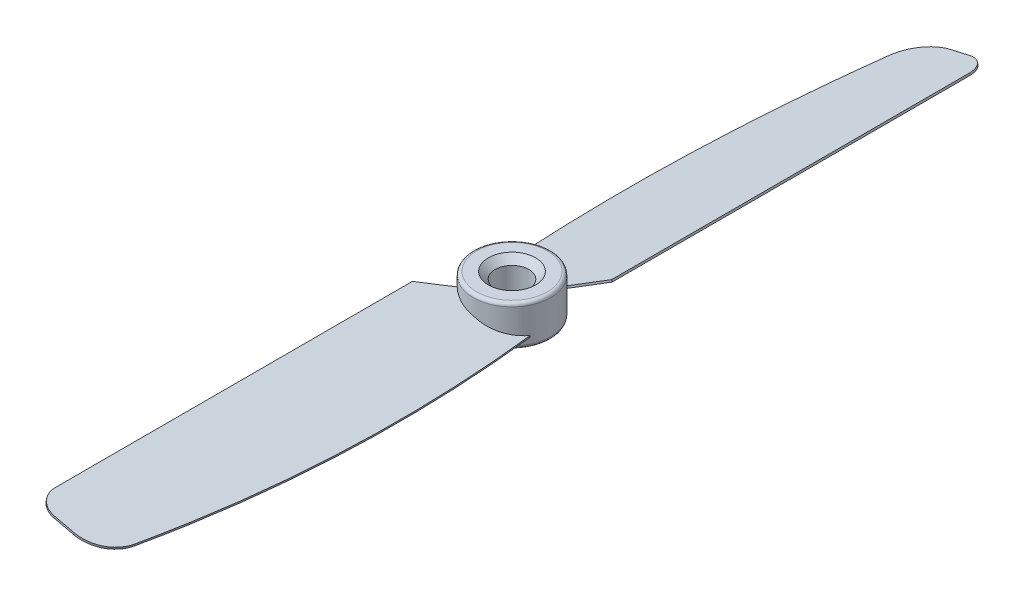
ISO-10303-21;
HEADER;
FILE_DESCRIPTION(('STEP AP214'),'2;1');
FILE_NAME('part.step','',(''),(''),'','','');
FILE_SCHEMA(('AUTOMOTIVE_DESIGN { 1 0 10303 214 1 1 1 1 }'));
ENDSEC;
DATA;
#1=APPLICATION_CONTEXT('core data for automotive mechanical design processes');
#2=APPLICATION_PROTOCOL_DEFINITION('international standard','automotive_design',2000,#1);
#3=PRODUCT_CONTEXT('',#1,'mechanical');
#4=PRODUCT('Part','Part','',(#3));
#5=PRODUCT_RELATED_PRODUCT_CATEGORY('part','',(#4));
#6=PRODUCT_DEFINITION_FORMATION('','',#4);
#7=PRODUCT_DEFINITION_CONTEXT('part definition',#1,'design');
#8=PRODUCT_DEFINITION('design','',#6,#7);
#9=PRODUCT_DEFINITION_SHAPE('','',#8);
#10=(LENGTH_UNIT() NAMED_UNIT(*) SI_UNIT(.MILLI.,.METRE.));
#11=(NAMED_UNIT(*) PLANE_ANGLE_UNIT() SI_UNIT($,.RADIAN.));
#12=(NAMED_UNIT(*) SI_UNIT($,.STERADIAN.) SOLID_ANGLE_UNIT());
#13=UNCERTAINTY_MEASURE_WITH_UNIT(LENGTH_MEASURE(1.E-05),#10,'distance_accuracy_value','');
#14=(GEOMETRIC_REPRESENTATION_CONTEXT(3) GLOBAL_UNCERTAINTY_ASSIGNED_CONTEXT((#13)) GLOBAL_UNIT_ASSIGNED_CONTEXT((#10,
#11,#12)) REPRESENTATION_CONTEXT('',''));
#15=CARTESIAN_POINT('',(0.,0.,0.));
#16=DIRECTION('',(0.,0.,1.));
#17=DIRECTION('',(1.,0.,0.));
#18=AXIS2_PLACEMENT_3D('',#15,#16,#17);
#19=CARTESIAN_POINT('',(0.,3.,0.));
#20=DIRECTION('',(0.,-1.,0.));
#21=DIRECTION('',(0.,0.,-1.));
#22=AXIS2_PLACEMENT_3D('',#19,#20,#21);
#23=CYLINDRICAL_SURFACE('',#22,5.75);
#24=CARTESIAN_POINT('',(0.,2.5,0.));
#25=DIRECTION('',(0.,1.,0.));
#26=DIRECTION('',(0.,0.,1.));
#27=AXIS2_PLACEMENT_3D('',#24,#25,#26);
#28=CIRCLE('',#27,5.75);
#29=CARTESIAN_POINT('',(0.,2.5,5.75));
#30=VERTEX_POINT('',#29);
#31=EDGE_CURVE('E391',#30,#30,#28,.F.);
#32=ORIENTED_EDGE('',*,*,#31,.T.);
#33=EDGE_LOOP('',(#32));
#34=FACE_BOUND('',#33,.T.);
#35=CARTESIAN_POINT('',(0.,-2.5,0.));
#36=DIRECTION('',(0.,1.,0.));
#37=DIRECTION('',(0.,0.,1.));
#38=AXIS2_PLACEMENT_3D('',#35,#36,#37);
#39=CIRCLE('',#38,5.75);
#40=CARTESIAN_POINT('',(0.,-2.5,5.75));
#41=VERTEX_POINT('',#40);
#42=EDGE_CURVE('E386',#41,#41,#39,.T.);
#43=ORIENTED_EDGE('',*,*,#42,.T.);
#44=EDGE_LOOP('',(#43));
#45=FACE_BOUND('',#44,.T.);
#46=CARTESIAN_POINT('',(0.,-0.153945616169009,0.));
#47=DIRECTION('',(0.224951054343865,0.974370064785235,0.));
#48=DIRECTION('',(0.974370064785235,-0.224951054343865,0.));
#49=AXIS2_PLACEMENT_3D('',#46,#47,#48);
#50=ELLIPSE('',#49,5.901248619812,5.75);
#51=CARTESIAN_POINT('',(-4.03001944572155,0.776457683465571,4.1013952829624));
#52=VERTEX_POINT('',#51);
#53=CARTESIAN_POINT('',(0.320003598356501,-0.227824268075246,5.74108854635071));
#54=VERTEX_POINT('',#53);
#55=EDGE_CURVE('E375',#52,#54,#50,.T.);
#56=ORIENTED_EDGE('',*,*,#55,.F.);
#57=CARTESIAN_POINT('',(0.,0.,0.));
#58=DIRECTION('',(0.688983680194812,-0.15906441596161,0.707106781186551));
#59=DIRECTION('',(-0.111006093354591,-0.987268206504591,-0.113926009599915));
#60=AXIS2_PLACEMENT_3D('',#57,#58,#59);
#61=ELLIPSE('',#60,36.1488769517612,5.75);
#62=CARTESIAN_POINT('',(-3.99540088649439,1.07635659165544,4.13512657075934));
#63=VERTEX_POINT('',#62);
#64=EDGE_CURVE('E373',#63,#52,#61,.T.);
#65=ORIENTED_EDGE('',*,*,#64,.F.);
#66=CARTESIAN_POINT('',(0.,0.15394561616901,0.));
#67=DIRECTION('',(0.224951054343865,0.974370064785235,0.));
#68=DIRECTION('',(0.974370064785235,-0.224951054343865,0.));
#69=AXIS2_PLACEMENT_3D('',#66,#67,#68);
#70=ELLIPSE('',#69,5.901248619812,5.75);
#71=CARTESIAN_POINT('',(0.354622157582757,0.0720746401148332,5.73905420129059));
#72=VERTEX_POINT('',#71);
#73=EDGE_CURVE('E368',#63,#72,#70,.T.);
#74=ORIENTED_EDGE('',*,*,#73,.T.);
#75=CARTESIAN_POINT('',(0.320003598355211,-0.227824268074948,5.74108854635067));
#76=CARTESIAN_POINT('',(0.325773371717187,-0.177840999841647,5.74076694689686));
#77=CARTESIAN_POINT('',(0.331543138333826,-0.127857790042508,5.74043661841495));
#78=CARTESIAN_POINT('',(0.343082658076429,-0.0278914873125538,5.73975850339492));
#79=CARTESIAN_POINT('',(0.348852411202394,0.0220916056182614,5.7394107168568));
#80=CARTESIAN_POINT('',(0.354622157583022,0.0720746401149147,5.73905420129059));
#81=B_SPLINE_CURVE_WITH_KNOTS('',3,(#75,#76,#77,#78,#79,#80),.UNSPECIFIED.,.F.,.F.,(4,2,4),(0.,
0.150948617979333,0.301897235958666),.UNSPECIFIED.);
#82=EDGE_CURVE('E220',#54,#72,#81,.T.);
#83=ORIENTED_EDGE('',*,*,#82,.F.);
#84=EDGE_LOOP('',(#56,#65,#74,#83));
#85=FACE_BOUND('',#84,.T.);
#86=CARTESIAN_POINT('',(0.,-0.153945616169009,0.));
#87=DIRECTION('',(-0.224951054343865,0.974370064785235,0.));
#88=DIRECTION('',(-0.974370064785235,-0.224951054343865,0.));
#89=AXIS2_PLACEMENT_3D('',#86,#87,#88);
#90=ELLIPSE('',#89,5.901248619812,5.75);
#91=CARTESIAN_POINT('',(4.03001944572155,0.776457683465571,-4.1013952829624));
#92=VERTEX_POINT('',#91);
#93=CARTESIAN_POINT('',(-0.320003598356501,-0.227824268075246,-5.74108854635071));
#94=VERTEX_POINT('',#93);
#95=EDGE_CURVE('E383',#92,#94,#90,.T.);
#96=ORIENTED_EDGE('',*,*,#95,.F.);
#97=CARTESIAN_POINT('',(0.,0.,0.));
#98=DIRECTION('',(-0.688983680194812,-0.15906441596161,-0.707106781186551));
#99=DIRECTION('',(0.111006093354591,-0.987268206504591,0.113926009599915));
#100=AXIS2_PLACEMENT_3D('',#97,#98,#99);
#101=ELLIPSE('',#100,36.1488769517612,5.75);
#102=CARTESIAN_POINT('',(3.99540088649439,1.07635659165544,-4.13512657075934));
#103=VERTEX_POINT('',#102);
#104=EDGE_CURVE('E237',#103,#92,#101,.T.);
#105=ORIENTED_EDGE('',*,*,#104,.F.);
#106=CARTESIAN_POINT('',(0.,0.15394561616901,0.));
#107=DIRECTION('',(-0.224951054343865,0.974370064785235,0.));
#108=DIRECTION('',(-0.974370064785235,-0.224951054343865,0.));
#109=AXIS2_PLACEMENT_3D('',#106,#107,#108);
#110=ELLIPSE('',#109,5.901248619812,5.75);
#111=CARTESIAN_POINT('',(-0.354622157582757,0.0720746401148332,-5.73905420129059));
#112=VERTEX_POINT('',#111);
#113=EDGE_CURVE('E238',#103,#112,#110,.T.);
#114=ORIENTED_EDGE('',*,*,#113,.T.);
#115=CARTESIAN_POINT('',(-0.320003598355211,-0.227824268074948,-5.74108854635067));
#116=CARTESIAN_POINT('',(-0.325773371717187,-0.177840999841647,-5.74076694689686));
#117=CARTESIAN_POINT('',(-0.331543138333826,-0.127857790042508,-5.74043661841495));
#118=CARTESIAN_POINT('',(-0.343082658076429,-0.0278914873125538,-5.73975850339492));
#119=CARTESIAN_POINT('',(-0.348852411202394,0.0220916056182614,-5.7394107168568));
#120=CARTESIAN_POINT('',(-0.354622157583022,0.0720746401149147,-5.73905420129059));
#121=B_SPLINE_CURVE_WITH_KNOTS('',3,(#115,#116,#117,#118,#119,#120),.UNSPECIFIED.,.F.,.F.,(4,2,
4),(0.,0.150948617979333,0.301897235958666),.UNSPECIFIED.);
#122=EDGE_CURVE('E229',#94,#112,#121,.T.);
#123=ORIENTED_EDGE('',*,*,#122,.F.);
#124=EDGE_LOOP('',(#96,#105,#114,#123));
#125=FACE_BOUND('',#124,.T.);
#126=ADVANCED_FACE('F38',(#34,#45,#85,#125),#23,.T.);
#127=CARTESIAN_POINT('',(0.,3.,0.));
#128=DIRECTION('',(0.,1.,0.));
#129=DIRECTION('',(0.,0.,1.));
#130=AXIS2_PLACEMENT_3D('',#127,#128,#129);
#131=PLANE('',#130);
#132=CARTESIAN_POINT('',(0.,3.,0.));
#133=DIRECTION('',(0.,1.,0.));
#134=DIRECTION('',(0.,0.,1.));
#135=AXIS2_PLACEMENT_3D('',#132,#133,#134);
#136=CIRCLE('',#135,3.5);
#137=CARTESIAN_POINT('',(0.,3.,3.5));
#138=VERTEX_POINT('',#137);
#139=EDGE_CURVE('E46',#138,#138,#136,.F.);
#140=ORIENTED_EDGE('',*,*,#139,.T.);
#141=EDGE_LOOP('',(#140));
#142=FACE_BOUND('',#141,.T.);
#143=CARTESIAN_POINT('',(0.,3.,0.));
#144=DIRECTION('',(0.,1.,0.));
#145=DIRECTION('',(0.,0.,1.));
#146=AXIS2_PLACEMENT_3D('',#143,#144,#145);
#147=CIRCLE('',#146,5.25);
#148=CARTESIAN_POINT('',(0.,3.,5.25));
#149=VERTEX_POINT('',#148);
#150=EDGE_CURVE('E384',#149,#149,#147,.T.);
#151=ORIENTED_EDGE('',*,*,#150,.T.);
#152=EDGE_LOOP('',(#151));
#153=FACE_BOUND('',#152,.T.);
#154=ADVANCED_FACE('F204',(#142,#153),#131,.T.);
#155=CARTESIAN_POINT('',(0.,-3.,0.));
#156=DIRECTION('',(0.,1.,0.));
#157=DIRECTION('',(0.,0.,1.));
#158=AXIS2_PLACEMENT_3D('',#155,#156,#157);
#159=PLANE('',#158);
#160=CARTESIAN_POINT('',(0.,-3.,0.));
#161=DIRECTION('',(0.,1.,0.));
#162=DIRECTION('',(0.,0.,1.));
#163=AXIS2_PLACEMENT_3D('',#160,#161,#162);
#164=CIRCLE('',#163,3.50000000000002);
#165=CARTESIAN_POINT('',(0.,-3.,3.50000000000002));
#166=VERTEX_POINT('',#165);
#167=EDGE_CURVE('E400',#166,#166,#164,.T.);
#168=ORIENTED_EDGE('',*,*,#167,.T.);
#169=EDGE_LOOP('',(#168));
#170=FACE_BOUND('',#169,.T.);
#171=CARTESIAN_POINT('',(0.,-3.,0.));
#172=DIRECTION('',(0.,1.,0.));
#173=DIRECTION('',(0.,0.,1.));
#174=AXIS2_PLACEMENT_3D('',#171,#172,#173);
#175=CIRCLE('',#174,5.25);
#176=CARTESIAN_POINT('',(0.,-3.,5.25));
#177=VERTEX_POINT('',#176);
#178=EDGE_CURVE('E394',#177,#177,#175,.F.);
#179=ORIENTED_EDGE('',*,*,#178,.T.);
#180=EDGE_LOOP('',(#179));
#181=FACE_BOUND('',#180,.T.);
#182=ADVANCED_FACE('F207',(#170,#181),#159,.F.);
#183=CARTESIAN_POINT('',(0.623814062032037,-0.297964440269035,0.));
#184=DIRECTION('',(0.224951054343865,0.974370064785235,0.));
#185=DIRECTION('',(0.,0.,1.));
#186=AXIS2_PLACEMENT_3D('',#183,#184,#185);
#187=ELLIPSE('',#186,5.75,5.6026278725151);
#188=DIRECTION('',(0.224951054343865,0.974370064785235,0.));
#189=VECTOR('',#188,1.);
#190=SURFACE_OF_LINEAR_EXTRUSION('',#187,#189);
#191=CARTESIAN_POINT('',(5.40264729283115,-1.40124502395436,2.77955364340424));
#192=VERTEX_POINT('',#191);
#193=EDGE_CURVE('E329',#54,#192,#187,.T.);
#194=ORIENTED_EDGE('',*,*,#193,.F.);
#195=ORIENTED_EDGE('',*,*,#82,.T.);
#196=CARTESIAN_POINT('',(0.691299378335197,-0.0056534208334647,0.));
#197=DIRECTION('',(0.224951054343865,0.974370064785235,0.));
#198=DIRECTION('',(0.,0.,1.));
#199=AXIS2_PLACEMENT_3D('',#196,#197,#198);
#200=ELLIPSE('',#199,5.75,5.6026278725151);
#201=CARTESIAN_POINT('',(5.47013260913431,-1.10893400451879,2.77955364340424));
#202=VERTEX_POINT('',#201);
#203=EDGE_CURVE('E61',#72,#202,#200,.T.);
#204=ORIENTED_EDGE('',*,*,#203,.T.);
#205=DIRECTION('',(0.224951054343865,0.974370064785235,0.));
#206=VECTOR('',#205,1.);
#207=CARTESIAN_POINT('',(5.40264729283115,-1.40124502395436,2.77955364340424));
#208=LINE('',#207,#206);
#209=EDGE_CURVE('E332',#192,#202,#208,.T.);
#210=ORIENTED_EDGE('',*,*,#209,.F.);
#211=EDGE_LOOP('',(#194,#195,#204,#210));
#212=FACE_BOUND('',#211,.T.);
#213=ADVANCED_FACE('F201',(#212),#190,.F.);
#214=CARTESIAN_POINT('',(5.40264729283115,-1.40124502395436,2.77955364340424));
#215=CARTESIAN_POINT('',(7.18119652909675,-1.81185546895875,21.7346837459891));
#216=CARTESIAN_POINT('',(6.49216360085611,-1.65277968318988,40.6199195444297));
#217=CARTESIAN_POINT('',(3.33984592647987,-0.925009803853498,59.3510007676822));
#218=B_SPLINE_CURVE_WITH_KNOTS('',3,(#214,#215,#216,#217),.UNSPECIFIED.,.F.,.F.,(4,4),(0.,
0.931210361074994),.UNSPECIFIED.);
#219=DIRECTION('',(0.224951054343865,0.974370064785235,0.));
#220=VECTOR('',#219,1.);
#221=SURFACE_OF_LINEAR_EXTRUSION('',#218,#220);
#222=CARTESIAN_POINT('',(5.47013260913431,-1.10893400451879,2.77955364340424));
#223=CARTESIAN_POINT('',(7.24868184539991,-1.51954444952318,21.7346837459891));
#224=CARTESIAN_POINT('',(6.55964891715927,-1.36046866375431,40.6199195444297));
#225=CARTESIAN_POINT('',(3.40733124278303,-0.632698784417927,59.3510007676822));
#226=B_SPLINE_CURVE_WITH_KNOTS('',3,(#222,#223,#224,#225),.UNSPECIFIED.,.F.,.F.,(4,4),(0.,
0.931210361074994),.UNSPECIFIED.);
#227=CARTESIAN_POINT('',(3.40733124278303,-0.632698784417927,59.3510007676822));
#228=VERTEX_POINT('',#227);
#229=EDGE_CURVE('E175',#202,#228,#226,.T.);
#230=ORIENTED_EDGE('',*,*,#229,.T.);
#231=DIRECTION('',(0.224951054343865,0.974370064785235,0.));
#232=VECTOR('',#231,1.);
#233=CARTESIAN_POINT('',(3.33984592647987,-0.925009803853498,59.3510007676822));
#234=LINE('',#233,#232);
#235=CARTESIAN_POINT('',(3.33984592647987,-0.925009803853498,59.3510007676822));
#236=VERTEX_POINT('',#235);
#237=EDGE_CURVE('E366',#236,#228,#234,.T.);
#238=ORIENTED_EDGE('',*,*,#237,.F.);
#239=EDGE_CURVE('E184',#192,#236,#218,.T.);
#240=ORIENTED_EDGE('',*,*,#239,.F.);
#241=ORIENTED_EDGE('',*,*,#209,.T.);
#242=EDGE_LOOP('',(#230,#238,#240,#241));
#243=FACE_BOUND('',#242,.T.);
#244=ADVANCED_FACE('F196',(#243),#221,.F.);
#245=CARTESIAN_POINT('',(-1.46092172720839,0.183334740367627,58.5));
#246=DIRECTION('',(0.224951054343865,0.974370064785235,0.));
#247=DIRECTION('',(-0.974370064785235,0.224951054343865,0.));
#248=AXIS2_PLACEMENT_3D('',#245,#246,#247);
#249=CYLINDRICAL_SURFACE('',#248,5.);
#250=CARTESIAN_POINT('',(-1.39343641090523,0.475645759803197,58.5));
#251=DIRECTION('',(-0.224951054343865,-0.974370064785235,0.));
#252=DIRECTION('',(0.974370064785235,-0.224951054343865,0.));
#253=AXIS2_PLACEMENT_3D('',#250,#251,#252);
#254=CIRCLE('',#253,5.);
#255=CARTESIAN_POINT('',(-1.39343641090524,0.475645759803198,63.5));
#256=VERTEX_POINT('',#255);
#257=EDGE_CURVE('E178',#228,#256,#254,.T.);
#258=ORIENTED_EDGE('',*,*,#257,.T.);
#259=DIRECTION('',(0.224951054343865,0.974370064785235,0.));
#260=VECTOR('',#259,1.);
#261=CARTESIAN_POINT('',(-1.4609217272084,0.183334740367627,63.5));
#262=LINE('',#261,#260);
#263=CARTESIAN_POINT('',(-1.4609217272084,0.183334740367627,63.5));
#264=VERTEX_POINT('',#263);
#265=EDGE_CURVE('E363',#264,#256,#262,.T.);
#266=ORIENTED_EDGE('',*,*,#265,.F.);
#267=CARTESIAN_POINT('',(-1.46092172720839,0.183334740367627,58.5));
#268=DIRECTION('',(-0.224951054343865,-0.974370064785235,0.));
#269=DIRECTION('',(0.974370064785235,-0.224951054343865,0.));
#270=AXIS2_PLACEMENT_3D('',#267,#268,#269);
#271=CIRCLE('',#270,5.);
#272=EDGE_CURVE('E190',#236,#264,#271,.T.);
#273=ORIENTED_EDGE('',*,*,#272,.F.);
#274=ORIENTED_EDGE('',*,*,#237,.T.);
#275=EDGE_LOOP('',(#258,#266,#273,#274));
#276=FACE_BOUND('',#275,.T.);
#277=ADVANCED_FACE('F200',(#276),#249,.T.);
#278=CARTESIAN_POINT('',(-4.41674749653245,0.865740889013799,63.5));
#279=DIRECTION('',(0.,0.,-1.));
#280=DIRECTION('',(-1.,0.,0.));
#281=AXIS2_PLACEMENT_3D('',#278,#279,#280);
#282=PLANE('',#281);
#283=DIRECTION('',(-0.974370064785235,0.224951054343865,0.));
#284=VECTOR('',#283,1.);
#285=CARTESIAN_POINT('',(-4.34926218022929,1.15805190844937,63.5));
#286=LINE('',#285,#284);
#287=CARTESIAN_POINT('',(-4.34926218022929,1.15805190844937,63.5));
#288=VERTEX_POINT('',#287);
#289=EDGE_CURVE('E342',#256,#288,#286,.T.);
#290=ORIENTED_EDGE('',*,*,#289,.T.);
#291=DIRECTION('',(0.224951054343865,0.974370064785235,0.));
#292=VECTOR('',#291,1.);
#293=CARTESIAN_POINT('',(-4.41674749653245,0.865740889013799,63.5));
#294=LINE('',#293,#292);
#295=CARTESIAN_POINT('',(-4.41674749653245,0.865740889013799,63.5));
#296=VERTEX_POINT('',#295);
#297=EDGE_CURVE('E360',#296,#288,#294,.T.);
#298=ORIENTED_EDGE('',*,*,#297,.F.);
#299=DIRECTION('',(-0.974370064785235,0.224951054343865,0.));
#300=VECTOR('',#299,1.);
#301=CARTESIAN_POINT('',(-4.41674749653245,0.865740889013799,63.5));
#302=LINE('',#301,#300);
#303=EDGE_CURVE('E612',#264,#296,#302,.T.);
#304=ORIENTED_EDGE('',*,*,#303,.F.);
#305=ORIENTED_EDGE('',*,*,#265,.T.);
#306=EDGE_LOOP('',(#290,#298,#304,#305));
#307=FACE_BOUND('',#306,.T.);
#308=ADVANCED_FACE('F480',(#307),#282,.F.);
#309=CARTESIAN_POINT('',(-4.41674749653247,0.865740889013804,60.5));
#310=DIRECTION('',(0.224951054343865,0.974370064785235,0.));
#311=DIRECTION('',(-0.974370064785235,0.224951054343865,0.));
#312=AXIS2_PLACEMENT_3D('',#309,#310,#311);
#313=CYLINDRICAL_SURFACE('',#312,3.);
#314=CARTESIAN_POINT('',(-4.34926218022931,1.15805190844937,60.5));
#315=DIRECTION('',(-0.224951054343865,-0.974370064785235,0.));
#316=DIRECTION('',(-0.974370064785235,0.224951054343865,0.));
#317=AXIS2_PLACEMENT_3D('',#314,#315,#316);
#318=CIRCLE('',#317,3.);
#319=CARTESIAN_POINT('',(-7.27237237458502,1.83290507148097,60.5));
#320=VERTEX_POINT('',#319);
#321=EDGE_CURVE('E344',#288,#320,#318,.T.);
#322=ORIENTED_EDGE('',*,*,#321,.T.);
#323=DIRECTION('',(0.224951054343865,0.974370064785235,0.));
#324=VECTOR('',#323,1.);
#325=CARTESIAN_POINT('',(-7.33985769088818,1.5405940520454,60.5));
#326=LINE('',#325,#324);
#327=CARTESIAN_POINT('',(-7.33985769088818,1.5405940520454,60.5));
#328=VERTEX_POINT('',#327);
#329=EDGE_CURVE('E357',#328,#320,#326,.T.);
#330=ORIENTED_EDGE('',*,*,#329,.F.);
#331=CARTESIAN_POINT('',(-4.41674749653247,0.865740889013804,60.5));
#332=DIRECTION('',(-0.224951054343865,-0.974370064785235,0.));
#333=DIRECTION('',(-0.974370064785235,0.224951054343865,0.));
#334=AXIS2_PLACEMENT_3D('',#331,#332,#333);
#335=CIRCLE('',#334,3.);
#336=EDGE_CURVE('E621',#296,#328,#335,.T.);
#337=ORIENTED_EDGE('',*,*,#336,.F.);
#338=ORIENTED_EDGE('',*,*,#297,.T.);
#339=EDGE_LOOP('',(#322,#330,#337,#338));
#340=FACE_BOUND('',#339,.T.);
#341=ADVANCED_FACE('F473',(#340),#313,.T.);
#342=CARTESIAN_POINT('',(-7.33985769088821,1.54059405204541,7.49829587010858));
#343=DIRECTION('',(0.974370064785235,-0.224951054343865,0.));
#344=DIRECTION('',(0.224951054343865,0.974370064785235,0.));
#345=AXIS2_PLACEMENT_3D('',#342,#343,#344);
#346=PLANE('',#345);
#347=DIRECTION('',(0.,0.,-1.));
#348=VECTOR('',#347,1.);
#349=CARTESIAN_POINT('',(-7.27237237458505,1.83290507148098,7.49829587010858));
#350=LINE('',#349,#348);
#351=CARTESIAN_POINT('',(-7.27237237458505,1.83290507148098,7.49829587010858));
#352=VERTEX_POINT('',#351);
#353=EDGE_CURVE('E346',#320,#352,#350,.T.);
#354=ORIENTED_EDGE('',*,*,#353,.T.);
#355=DIRECTION('',(0.224951054343865,0.974370064785235,0.));
#356=VECTOR('',#355,1.);
#357=CARTESIAN_POINT('',(-7.33985769088821,1.54059405204541,7.49829587010858));
#358=LINE('',#357,#356);
#359=CARTESIAN_POINT('',(-7.33985769088821,1.54059405204541,7.49829587010858));
#360=VERTEX_POINT('',#359);
#361=EDGE_CURVE('E354',#360,#352,#358,.T.);
#362=ORIENTED_EDGE('',*,*,#361,.F.);
#363=DIRECTION('',(0.,0.,-1.));
#364=VECTOR('',#363,1.);
#365=CARTESIAN_POINT('',(-7.33985769088821,1.54059405204541,7.49829587010858));
#366=LINE('',#365,#364);
#367=EDGE_CURVE('E620',#328,#360,#366,.T.);
#368=ORIENTED_EDGE('',*,*,#367,.F.);
#369=ORIENTED_EDGE('',*,*,#329,.T.);
#370=EDGE_LOOP('',(#354,#362,#368,#369));
#371=FACE_BOUND('',#370,.T.);
#372=ADVANCED_FACE('F467',(#371),#346,.F.);
#373=CARTESIAN_POINT('',(-3.59249053159297,0.675446174495574,3.65235756111386));
#374=DIRECTION('',(0.688983680194812,-0.15906441596161,0.707106781186551));
#375=DIRECTION('',(0.716225617849128,0.,-0.697868801664492));
#376=AXIS2_PLACEMENT_3D('',#373,#374,#375);
#377=PLANE('',#376);
#378=DIRECTION('',(0.688983680194819,-0.159064415961612,-0.707106781186544));
#379=VECTOR('',#378,1.);
#380=CARTESIAN_POINT('',(-3.52500521528981,0.967757193931145,3.65235756111386));
#381=LINE('',#380,#379);
#382=EDGE_CURVE('E348',#352,#63,#381,.T.);
#383=ORIENTED_EDGE('',*,*,#382,.T.);
#384=ORIENTED_EDGE('',*,*,#64,.T.);
#385=DIRECTION('',(0.688983680194819,-0.159064415961612,-0.707106781186544));
#386=VECTOR('',#385,1.);
#387=CARTESIAN_POINT('',(-3.59249053159297,0.675446174495574,3.65235756111386));
#388=LINE('',#387,#386);
#389=EDGE_CURVE('E333',#360,#52,#388,.T.);
#390=ORIENTED_EDGE('',*,*,#389,.F.);
#391=ORIENTED_EDGE('',*,*,#361,.T.);
#392=EDGE_LOOP('',(#383,#384,#390,#391));
#393=FACE_BOUND('',#392,.T.);
#394=ADVANCED_FACE('F320',(#393),#377,.F.);
#395=CARTESIAN_POINT('',(6.2203217011462,-1.59002003553172,31.1492955352929));
#396=DIRECTION('',(0.224951054343865,0.974370064785235,0.));
#397=DIRECTION('',(-0.974370064785235,0.224951054343865,0.));
#398=AXIS2_PLACEMENT_3D('',#395,#396,#397);
#399=PLANE('',#398);
#400=ORIENTED_EDGE('',*,*,#389,.T.);
#401=ORIENTED_EDGE('',*,*,#55,.T.);
#402=ORIENTED_EDGE('',*,*,#193,.T.);
#403=ORIENTED_EDGE('',*,*,#239,.T.);
#404=ORIENTED_EDGE('',*,*,#272,.T.);
#405=ORIENTED_EDGE('',*,*,#303,.T.);
#406=ORIENTED_EDGE('',*,*,#336,.T.);
#407=ORIENTED_EDGE('',*,*,#367,.T.);
#408=EDGE_LOOP('',(#400,#401,#402,#403,#404,#405,#406,#407));
#409=FACE_BOUND('',#408,.T.);
#410=ADVANCED_FACE('F317',(#409),#399,.F.);
#411=CARTESIAN_POINT('',(6.28780701744936,-1.29770901609615,31.1492955352929));
#412=DIRECTION('',(0.224951054343865,0.974370064785235,0.));
#413=DIRECTION('',(-0.974370064785235,0.224951054343865,0.));
#414=AXIS2_PLACEMENT_3D('',#411,#412,#413);
#415=PLANE('',#414);
#416=ORIENTED_EDGE('',*,*,#73,.F.);
#417=ORIENTED_EDGE('',*,*,#382,.F.);
#418=ORIENTED_EDGE('',*,*,#353,.F.);
#419=ORIENTED_EDGE('',*,*,#321,.F.);
#420=ORIENTED_EDGE('',*,*,#289,.F.);
#421=ORIENTED_EDGE('',*,*,#257,.F.);
#422=ORIENTED_EDGE('',*,*,#229,.F.);
#423=ORIENTED_EDGE('',*,*,#203,.F.);
#424=EDGE_LOOP('',(#416,#417,#418,#419,#420,#421,#422,#423));
#425=FACE_BOUND('',#424,.T.);
#426=ADVANCED_FACE('F247',(#425),#415,.T.);
#427=CARTESIAN_POINT('',(-0.623814062032037,-0.297964440269035,0.));
#428=DIRECTION('',(-0.224951054343865,0.974370064785235,0.));
#429=DIRECTION('',(0.,0.,-1.));
#430=AXIS2_PLACEMENT_3D('',#427,#428,#429);
#431=ELLIPSE('',#430,5.75,5.6026278725151);
#432=DIRECTION('',(-0.224951054343865,0.974370064785235,0.));
#433=VECTOR('',#432,1.);
#434=SURFACE_OF_LINEAR_EXTRUSION('',#431,#433);
#435=CARTESIAN_POINT('',(-5.40264729283115,-1.40124502395436,-2.77955364340424));
#436=VERTEX_POINT('',#435);
#437=EDGE_CURVE('E168',#94,#436,#431,.T.);
#438=ORIENTED_EDGE('',*,*,#437,.F.);
#439=ORIENTED_EDGE('',*,*,#122,.T.);
#440=CARTESIAN_POINT('',(-0.691299378335197,-0.0056534208334647,0.));
#441=DIRECTION('',(-0.224951054343865,0.974370064785235,0.));
#442=DIRECTION('',(0.,0.,-1.));
#443=AXIS2_PLACEMENT_3D('',#440,#441,#442);
#444=ELLIPSE('',#443,5.75,5.6026278725151);
#445=CARTESIAN_POINT('',(-5.47013260913431,-1.10893400451879,-2.77955364340424));
#446=VERTEX_POINT('',#445);
#447=EDGE_CURVE('E53',#112,#446,#444,.T.);
#448=ORIENTED_EDGE('',*,*,#447,.T.);
#449=DIRECTION('',(-0.224951054343865,0.974370064785235,0.));
#450=VECTOR('',#449,1.);
#451=CARTESIAN_POINT('',(-5.40264729283115,-1.40124502395436,-2.77955364340424));
#452=LINE('',#451,#450);
#453=EDGE_CURVE('E256',#436,#446,#452,.T.);
#454=ORIENTED_EDGE('',*,*,#453,.F.);
#455=EDGE_LOOP('',(#438,#439,#448,#454));
#456=FACE_BOUND('',#455,.T.);
#457=ADVANCED_FACE('F241',(#456),#434,.F.);
#458=CARTESIAN_POINT('',(-5.40264729283115,-1.40124502395436,-2.77955364340424));
#459=CARTESIAN_POINT('',(-7.18119652909675,-1.81185546895875,-21.7346837459891));
#460=CARTESIAN_POINT('',(-6.49216360085611,-1.65277968318988,-40.6199195444297));
#461=CARTESIAN_POINT('',(-3.33984592647987,-0.925009803853498,-59.3510007676822));
#462=B_SPLINE_CURVE_WITH_KNOTS('',3,(#458,#459,#460,#461),.UNSPECIFIED.,.F.,.F.,(4,4),(0.,
0.931210361074994),.UNSPECIFIED.);
#463=DIRECTION('',(-0.224951054343865,0.974370064785235,0.));
#464=VECTOR('',#463,1.);
#465=SURFACE_OF_LINEAR_EXTRUSION('',#462,#464);
#466=CARTESIAN_POINT('',(-5.47013260913431,-1.10893400451879,-2.77955364340424));
#467=CARTESIAN_POINT('',(-7.24868184539991,-1.51954444952318,-21.7346837459891));
#468=CARTESIAN_POINT('',(-6.55964891715927,-1.36046866375431,-40.6199195444297));
#469=CARTESIAN_POINT('',(-3.40733124278303,-0.632698784417927,-59.3510007676822));
#470=B_SPLINE_CURVE_WITH_KNOTS('',3,(#466,#467,#468,#469),.UNSPECIFIED.,.F.,.F.,(4,4),(0.,
0.931210361074994),.UNSPECIFIED.);
#471=CARTESIAN_POINT('',(-3.40733124278303,-0.632698784417927,-59.3510007676822));
#472=VERTEX_POINT('',#471);
#473=EDGE_CURVE('E174',#446,#472,#470,.T.);
#474=ORIENTED_EDGE('',*,*,#473,.T.);
#475=DIRECTION('',(-0.224951054343865,0.974370064785235,0.));
#476=VECTOR('',#475,1.);
#477=CARTESIAN_POINT('',(-3.33984592647987,-0.925009803853498,-59.3510007676822));
#478=LINE('',#477,#476);
#479=CARTESIAN_POINT('',(-3.33984592647987,-0.925009803853498,-59.3510007676822));
#480=VERTEX_POINT('',#479);
#481=EDGE_CURVE('E155',#480,#472,#478,.T.);
#482=ORIENTED_EDGE('',*,*,#481,.F.);
#483=EDGE_CURVE('E162',#436,#480,#462,.T.);
#484=ORIENTED_EDGE('',*,*,#483,.F.);
#485=ORIENTED_EDGE('',*,*,#453,.T.);
#486=EDGE_LOOP('',(#474,#482,#484,#485));
#487=FACE_BOUND('',#486,.T.);
#488=ADVANCED_FACE('F173',(#487),#465,.F.);
#489=CARTESIAN_POINT('',(1.46092172720839,0.183334740367627,-58.5));
#490=DIRECTION('',(-0.224951054343865,0.974370064785235,0.));
#491=DIRECTION('',(-0.974370064785235,-0.224951054343865,0.));
#492=AXIS2_PLACEMENT_3D('',#489,#490,#491);
#493=CYLINDRICAL_SURFACE('',#492,5.);
#494=CARTESIAN_POINT('',(1.39343641090523,0.475645759803197,-58.5));
#495=DIRECTION('',(0.224951054343865,-0.974370064785235,0.));
#496=DIRECTION('',(-0.974370064785235,-0.224951054343865,0.));
#497=AXIS2_PLACEMENT_3D('',#494,#495,#496);
#498=CIRCLE('',#497,5.);
#499=CARTESIAN_POINT('',(1.39343641090524,0.475645759803198,-63.5));
#500=VERTEX_POINT('',#499);
#501=EDGE_CURVE('E262',#472,#500,#498,.T.);
#502=ORIENTED_EDGE('',*,*,#501,.T.);
#503=DIRECTION('',(-0.224951054343865,0.974370064785235,0.));
#504=VECTOR('',#503,1.);
#505=CARTESIAN_POINT('',(1.4609217272084,0.183334740367627,-63.5));
#506=LINE('',#505,#504);
#507=CARTESIAN_POINT('',(1.4609217272084,0.183334740367627,-63.5));
#508=VERTEX_POINT('',#507);
#509=EDGE_CURVE('E158',#508,#500,#506,.T.);
#510=ORIENTED_EDGE('',*,*,#509,.F.);
#511=CARTESIAN_POINT('',(1.46092172720839,0.183334740367627,-58.5));
#512=DIRECTION('',(0.224951054343865,-0.974370064785235,0.));
#513=DIRECTION('',(-0.974370064785235,-0.224951054343865,0.));
#514=AXIS2_PLACEMENT_3D('',#511,#512,#513);
#515=CIRCLE('',#514,5.);
#516=EDGE_CURVE('E151',#480,#508,#515,.T.);
#517=ORIENTED_EDGE('',*,*,#516,.F.);
#518=ORIENTED_EDGE('',*,*,#481,.T.);
#519=EDGE_LOOP('',(#502,#510,#517,#518));
#520=FACE_BOUND('',#519,.T.);
#521=ADVANCED_FACE('F153',(#520),#493,.T.);
#522=CARTESIAN_POINT('',(4.41674749653245,0.865740889013799,-63.5));
#523=DIRECTION('',(0.,0.,1.));
#524=DIRECTION('',(1.,0.,0.));
#525=AXIS2_PLACEMENT_3D('',#522,#523,#524);
#526=PLANE('',#525);
#527=DIRECTION('',(0.974370064785235,0.224951054343865,0.));
#528=VECTOR('',#527,1.);
#529=CARTESIAN_POINT('',(4.34926218022929,1.15805190844937,-63.5));
#530=LINE('',#529,#528);
#531=CARTESIAN_POINT('',(4.34926218022929,1.15805190844937,-63.5));
#532=VERTEX_POINT('',#531);
#533=EDGE_CURVE('E267',#500,#532,#530,.T.);
#534=ORIENTED_EDGE('',*,*,#533,.T.);
#535=DIRECTION('',(-0.224951054343865,0.974370064785235,0.));
#536=VECTOR('',#535,1.);
#537=CARTESIAN_POINT('',(4.41674749653245,0.865740889013799,-63.5));
#538=LINE('',#537,#536);
#539=CARTESIAN_POINT('',(4.41674749653245,0.865740889013799,-63.5));
#540=VERTEX_POINT('',#539);
#541=EDGE_CURVE('E180',#540,#532,#538,.T.);
#542=ORIENTED_EDGE('',*,*,#541,.F.);
#543=DIRECTION('',(0.974370064785235,0.224951054343865,0.));
#544=VECTOR('',#543,1.);
#545=CARTESIAN_POINT('',(4.41674749653245,0.865740889013799,-63.5));
#546=LINE('',#545,#544);
#547=EDGE_CURVE('E161',#508,#540,#546,.T.);
#548=ORIENTED_EDGE('',*,*,#547,.F.);
#549=ORIENTED_EDGE('',*,*,#509,.T.);
#550=EDGE_LOOP('',(#534,#542,#548,#549));
#551=FACE_BOUND('',#550,.T.);
#552=ADVANCED_FACE('F437',(#551),#526,.F.);
#553=CARTESIAN_POINT('',(4.41674749653247,0.865740889013804,-60.5));
#554=DIRECTION('',(-0.224951054343865,0.974370064785235,0.));
#555=DIRECTION('',(-0.974370064785235,-0.224951054343865,0.));
#556=AXIS2_PLACEMENT_3D('',#553,#554,#555);
#557=CYLINDRICAL_SURFACE('',#556,3.);
#558=CARTESIAN_POINT('',(4.34926218022931,1.15805190844937,-60.5));
#559=DIRECTION('',(0.224951054343865,-0.974370064785235,0.));
#560=DIRECTION('',(0.974370064785235,0.224951054343865,0.));
#561=AXIS2_PLACEMENT_3D('',#558,#559,#560);
#562=CIRCLE('',#561,3.);
#563=CARTESIAN_POINT('',(7.27237237458502,1.83290507148097,-60.5));
#564=VERTEX_POINT('',#563);
#565=EDGE_CURVE('E269',#532,#564,#562,.T.);
#566=ORIENTED_EDGE('',*,*,#565,.T.);
#567=DIRECTION('',(-0.224951054343865,0.974370064785235,0.));
#568=VECTOR('',#567,1.);
#569=CARTESIAN_POINT('',(7.33985769088818,1.5405940520454,-60.5));
#570=LINE('',#569,#568);
#571=CARTESIAN_POINT('',(7.33985769088818,1.5405940520454,-60.5));
#572=VERTEX_POINT('',#571);
#573=EDGE_CURVE('E281',#572,#564,#570,.T.);
#574=ORIENTED_EDGE('',*,*,#573,.F.);
#575=CARTESIAN_POINT('',(4.41674749653247,0.865740889013804,-60.5));
#576=DIRECTION('',(0.224951054343865,-0.974370064785235,0.));
#577=DIRECTION('',(0.974370064785235,0.224951054343865,0.));
#578=AXIS2_PLACEMENT_3D('',#575,#576,#577);
#579=CIRCLE('',#578,3.);
#580=EDGE_CURVE('E290',#540,#572,#579,.T.);
#581=ORIENTED_EDGE('',*,*,#580,.F.);
#582=ORIENTED_EDGE('',*,*,#541,.T.);
#583=EDGE_LOOP('',(#566,#574,#581,#582));
#584=FACE_BOUND('',#583,.T.);
#585=ADVANCED_FACE('F288',(#584),#557,.T.);
#586=CARTESIAN_POINT('',(7.33985769088821,1.54059405204541,-7.49829587010858));
#587=DIRECTION('',(-0.974370064785235,-0.224951054343865,0.));
#588=DIRECTION('',(0.224951054343865,-0.974370064785235,0.));
#589=AXIS2_PLACEMENT_3D('',#586,#587,#588);
#590=PLANE('',#589);
#591=DIRECTION('',(0.,0.,1.));
#592=VECTOR('',#591,1.);
#593=CARTESIAN_POINT('',(7.27237237458505,1.83290507148098,-7.49829587010858));
#594=LINE('',#593,#592);
#595=CARTESIAN_POINT('',(7.27237237458505,1.83290507148098,-7.49829587010858));
#596=VERTEX_POINT('',#595);
#597=EDGE_CURVE('E271',#564,#596,#594,.T.);
#598=ORIENTED_EDGE('',*,*,#597,.T.);
#599=DIRECTION('',(-0.224951054343865,0.974370064785235,0.));
#600=VECTOR('',#599,1.);
#601=CARTESIAN_POINT('',(7.33985769088821,1.54059405204541,-7.49829587010858));
#602=LINE('',#601,#600);
#603=CARTESIAN_POINT('',(7.33985769088821,1.54059405204541,-7.49829587010858));
#604=VERTEX_POINT('',#603);
#605=EDGE_CURVE('E278',#604,#596,#602,.T.);
#606=ORIENTED_EDGE('',*,*,#605,.F.);
#607=DIRECTION('',(0.,0.,1.));
#608=VECTOR('',#607,1.);
#609=CARTESIAN_POINT('',(7.33985769088821,1.54059405204541,-7.49829587010858));
#610=LINE('',#609,#608);
#611=EDGE_CURVE('E303',#572,#604,#610,.T.);
#612=ORIENTED_EDGE('',*,*,#611,.F.);
#613=ORIENTED_EDGE('',*,*,#573,.T.);
#614=EDGE_LOOP('',(#598,#606,#612,#613));
#615=FACE_BOUND('',#614,.T.);
#616=ADVANCED_FACE('F297',(#615),#590,.F.);
#617=CARTESIAN_POINT('',(3.59249053159297,0.675446174495574,-3.65235756111386));
#618=DIRECTION('',(-0.688983680194812,-0.15906441596161,-0.707106781186551));
#619=DIRECTION('',(-0.716225617849128,0.,0.697868801664492));
#620=AXIS2_PLACEMENT_3D('',#617,#618,#619);
#621=PLANE('',#620);
#622=DIRECTION('',(-0.688983680194819,-0.159064415961612,0.707106781186544));
#623=VECTOR('',#622,1.);
#624=CARTESIAN_POINT('',(3.52500521528981,0.967757193931145,-3.65235756111386));
#625=LINE('',#624,#623);
#626=EDGE_CURVE('E273',#596,#103,#625,.T.);
#627=ORIENTED_EDGE('',*,*,#626,.T.);
#628=ORIENTED_EDGE('',*,*,#104,.T.);
#629=DIRECTION('',(-0.688983680194819,-0.159064415961612,0.707106781186544));
#630=VECTOR('',#629,1.);
#631=CARTESIAN_POINT('',(3.59249053159297,0.675446174495574,-3.65235756111386));
#632=LINE('',#631,#630);
#633=EDGE_CURVE('E257',#604,#92,#632,.T.);
#634=ORIENTED_EDGE('',*,*,#633,.F.);
#635=ORIENTED_EDGE('',*,*,#605,.T.);
#636=EDGE_LOOP('',(#627,#628,#634,#635));
#637=FACE_BOUND('',#636,.T.);
#638=ADVANCED_FACE('F251',(#637),#621,.F.);
#639=CARTESIAN_POINT('',(-6.2203217011462,-1.59002003553172,-31.1492955352929));
#640=DIRECTION('',(-0.224951054343865,0.974370064785235,0.));
#641=DIRECTION('',(0.974370064785235,0.224951054343865,0.));
#642=AXIS2_PLACEMENT_3D('',#639,#640,#641);
#643=PLANE('',#642);
#644=ORIENTED_EDGE('',*,*,#633,.T.);
#645=ORIENTED_EDGE('',*,*,#95,.T.);
#646=ORIENTED_EDGE('',*,*,#437,.T.);
#647=ORIENTED_EDGE('',*,*,#483,.T.);
#648=ORIENTED_EDGE('',*,*,#516,.T.);
#649=ORIENTED_EDGE('',*,*,#547,.T.);
#650=ORIENTED_EDGE('',*,*,#580,.T.);
#651=ORIENTED_EDGE('',*,*,#611,.T.);
#652=EDGE_LOOP('',(#644,#645,#646,#647,#648,#649,#650,#651));
#653=FACE_BOUND('',#652,.T.);
#654=ADVANCED_FACE('F166',(#653),#643,.F.);
#655=CARTESIAN_POINT('',(-6.28780701744936,-1.29770901609615,-31.1492955352929));
#656=DIRECTION('',(-0.224951054343865,0.974370064785235,0.));
#657=DIRECTION('',(0.974370064785235,0.224951054343865,0.));
#658=AXIS2_PLACEMENT_3D('',#655,#656,#657);
#659=PLANE('',#658);
#660=ORIENTED_EDGE('',*,*,#113,.F.);
#661=ORIENTED_EDGE('',*,*,#626,.F.);
#662=ORIENTED_EDGE('',*,*,#597,.F.);
#663=ORIENTED_EDGE('',*,*,#565,.F.);
#664=ORIENTED_EDGE('',*,*,#533,.F.);
#665=ORIENTED_EDGE('',*,*,#501,.F.);
#666=ORIENTED_EDGE('',*,*,#473,.F.);
#667=ORIENTED_EDGE('',*,*,#447,.F.);
#668=EDGE_LOOP('',(#660,#661,#662,#663,#664,#665,#666,#667));
#669=FACE_BOUND('',#668,.T.);
#670=ADVANCED_FACE('F249',(#669),#659,.T.);
#671=CARTESIAN_POINT('',(0.,3.,0.));
#672=DIRECTION('',(0.,-1.,0.));
#673=DIRECTION('',(0.,0.,-1.));
#674=AXIS2_PLACEMENT_3D('',#671,#672,#673);
#675=CYLINDRICAL_SURFACE('',#674,2.5);
#676=CARTESIAN_POINT('',(0.,1.99999999999999,0.));
#677=DIRECTION('',(0.,1.,0.));
#678=DIRECTION('',(0.,0.,1.));
#679=AXIS2_PLACEMENT_3D('',#676,#677,#678);
#680=CIRCLE('',#679,2.5);
#681=CARTESIAN_POINT('',(0.,1.99999999999999,2.5));
#682=VERTEX_POINT('',#681);
#683=EDGE_CURVE('E11',#682,#682,#680,.T.);
#684=ORIENTED_EDGE('',*,*,#683,.T.);
#685=EDGE_LOOP('',(#684));
#686=FACE_BOUND('',#685,.T.);
#687=CARTESIAN_POINT('',(0.,-1.99999999999999,0.));
#688=DIRECTION('',(0.,1.,0.));
#689=DIRECTION('',(0.,0.,1.));
#690=AXIS2_PLACEMENT_3D('',#687,#688,#689);
#691=CIRCLE('',#690,2.5);
#692=CARTESIAN_POINT('',(0.,-1.99999999999999,2.5));
#693=VERTEX_POINT('',#692);
#694=EDGE_CURVE('E397',#693,#693,#691,.F.);
#695=ORIENTED_EDGE('',*,*,#694,.T.);
#696=EDGE_LOOP('',(#695));
#697=FACE_BOUND('',#696,.T.);
#698=ADVANCED_FACE('F416',(#686,#697),#675,.F.);
#699=CARTESIAN_POINT('',(0.,2.5,0.));
#700=DIRECTION('',(0.,1.,0.));
#701=DIRECTION('',(0.,0.,1.));
#702=AXIS2_PLACEMENT_3D('',#699,#700,#701);
#703=TOROIDAL_SURFACE('',#702,5.25,0.5);
#704=ORIENTED_EDGE('',*,*,#31,.F.);
#705=EDGE_LOOP('',(#704));
#706=FACE_BOUND('',#705,.T.);
#707=ORIENTED_EDGE('',*,*,#150,.F.);
#708=EDGE_LOOP('',(#707));
#709=FACE_BOUND('',#708,.T.);
#710=ADVANCED_FACE('F216',(#706,#709),#703,.T.);
#711=CARTESIAN_POINT('',(0.,-2.5,0.));
#712=DIRECTION('',(0.,1.,0.));
#713=DIRECTION('',(0.,0.,1.));
#714=AXIS2_PLACEMENT_3D('',#711,#712,#713);
#715=TOROIDAL_SURFACE('',#714,5.25,0.5);
#716=ORIENTED_EDGE('',*,*,#178,.F.);
#717=EDGE_LOOP('',(#716));
#718=FACE_BOUND('',#717,.T.);
#719=ORIENTED_EDGE('',*,*,#42,.F.);
#720=EDGE_LOOP('',(#719));
#721=FACE_BOUND('',#720,.T.);
#722=ADVANCED_FACE('F412',(#718,#721),#715,.T.);
#723=CARTESIAN_POINT('',(0.,-1.99999999999999,0.));
#724=DIRECTION('',(0.,-1.,0.));
#725=DIRECTION('',(0.,0.,-1.));
#726=AXIS2_PLACEMENT_3D('',#723,#724,#725);
#727=CONICAL_SURFACE('',#726,2.5,0.785398163397451);
#728=ORIENTED_EDGE('',*,*,#167,.F.);
#729=EDGE_LOOP('',(#728));
#730=FACE_BOUND('',#729,.T.);
#731=ORIENTED_EDGE('',*,*,#694,.F.);
#732=EDGE_LOOP('',(#731));
#733=FACE_BOUND('',#732,.T.);
#734=ADVANCED_FACE('F407',(#730,#733),#727,.F.);
#735=CARTESIAN_POINT('',(0.,3.,0.));
#736=DIRECTION('',(0.,1.,0.));
#737=DIRECTION('',(0.,0.,1.));
#738=AXIS2_PLACEMENT_3D('',#735,#736,#737);
#739=CONICAL_SURFACE('',#738,3.5,0.785398163397446);
#740=ORIENTED_EDGE('',*,*,#683,.F.);
#741=EDGE_LOOP('',(#740));
#742=FACE_BOUND('',#741,.T.);
#743=ORIENTED_EDGE('',*,*,#139,.F.);
#744=EDGE_LOOP('',(#743));
#745=FACE_BOUND('',#744,.T.);
#746=ADVANCED_FACE('F40',(#742,#745),#739,.F.);
#747=CLOSED_SHELL('',(#126,#154,#182,#213,#244,#277,#308,#341,#372,#394,#410,#426,#457,#488,
#521,#552,#585,#616,#638,#654,#670,#698,#710,#722,#734,#746));
#748=MANIFOLD_SOLID_BREP('B2',#747);
#749=ADVANCED_BREP_SHAPE_REPRESENTATION('',(#18,#748),#14);
#750=SHAPE_DEFINITION_REPRESENTATION(#9,#749);
ENDSEC;
END-ISO-10303-21;
